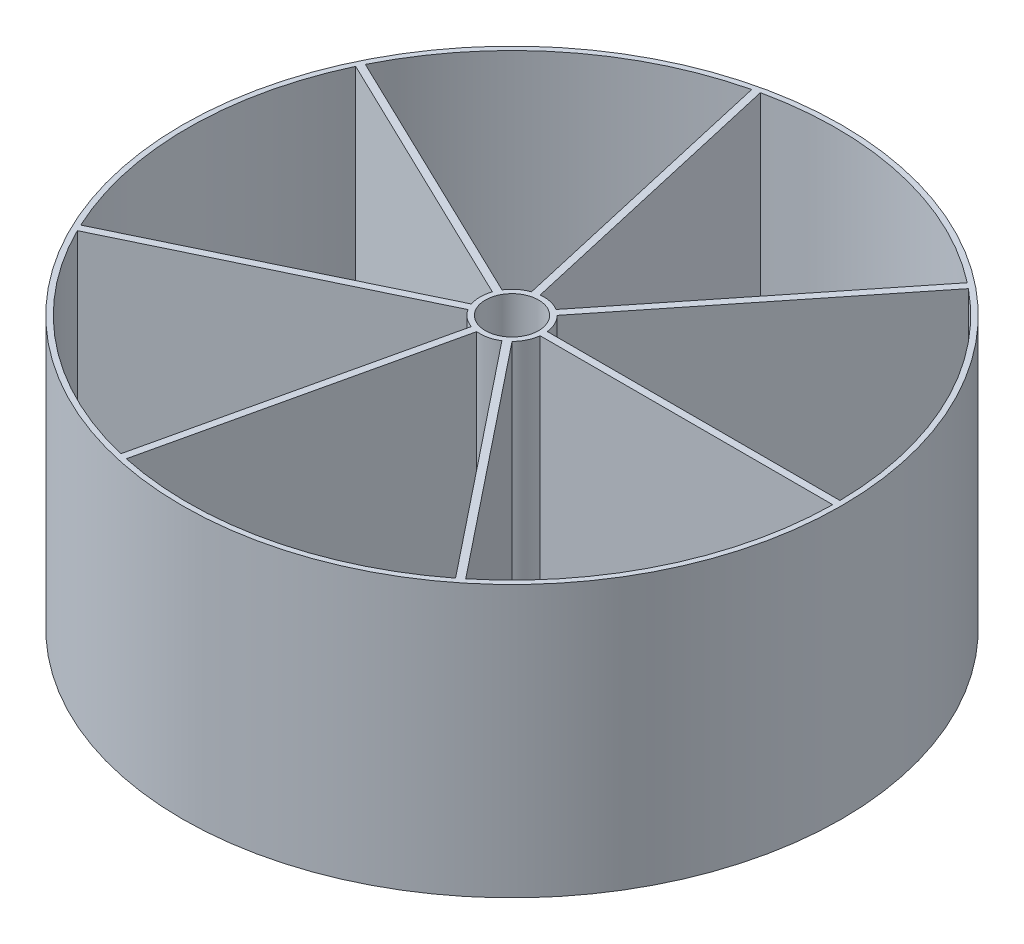
ISO-10303-21;
HEADER;
FILE_DESCRIPTION(('STEP AP214'),'2;1');
FILE_NAME('part.step','',(''),(''),'','','');
FILE_SCHEMA(('AUTOMOTIVE_DESIGN { 1 0 10303 214 1 1 1 1 }'));
ENDSEC;
DATA;
#1=APPLICATION_CONTEXT('core data for automotive mechanical design processes');
#2=APPLICATION_PROTOCOL_DEFINITION('international standard','automotive_design',2000,#1);
#3=PRODUCT_CONTEXT('',#1,'mechanical');
#4=PRODUCT('Part','Part','',(#3));
#5=PRODUCT_RELATED_PRODUCT_CATEGORY('part','',(#4));
#6=PRODUCT_DEFINITION_FORMATION('','',#4);
#7=PRODUCT_DEFINITION_CONTEXT('part definition',#1,'design');
#8=PRODUCT_DEFINITION('design','',#6,#7);
#9=PRODUCT_DEFINITION_SHAPE('','',#8);
#10=(LENGTH_UNIT() NAMED_UNIT(*) SI_UNIT(.MILLI.,.METRE.));
#11=(NAMED_UNIT(*) PLANE_ANGLE_UNIT() SI_UNIT($,.RADIAN.));
#12=(NAMED_UNIT(*) SI_UNIT($,.STERADIAN.) SOLID_ANGLE_UNIT());
#13=UNCERTAINTY_MEASURE_WITH_UNIT(LENGTH_MEASURE(1.E-05),#10,'distance_accuracy_value','');
#14=(GEOMETRIC_REPRESENTATION_CONTEXT(3) GLOBAL_UNCERTAINTY_ASSIGNED_CONTEXT((#13)) GLOBAL_UNIT_ASSIGNED_CONTEXT((#10,
#11,#12)) REPRESENTATION_CONTEXT('',''));
#15=CARTESIAN_POINT('',(0.,0.,0.));
#16=DIRECTION('',(0.,0.,1.));
#17=DIRECTION('',(1.,0.,0.));
#18=AXIS2_PLACEMENT_3D('',#15,#16,#17);
#19=CARTESIAN_POINT('',(0.,102.,0.));
#20=DIRECTION('',(0.,1.,0.));
#21=DIRECTION('',(0.,0.,1.));
#22=AXIS2_PLACEMENT_3D('',#19,#20,#21);
#23=PLANE('',#22);
#24=DIRECTION('',(0.900968867902416,0.,0.433883739117564));
#25=VECTOR('',#24,1.);
#26=CARTESIAN_POINT('',(-10.1516650680535,102.,-6.39872615026317));
#27=LINE('',#26,#25);
#28=CARTESIAN_POINT('',(-109.258240537319,102.,-54.1259374531951));
#29=VERTEX_POINT('',#28);
#30=CARTESIAN_POINT('',(-10.1516650680535,102.,-6.39872615026317));
#31=VERTEX_POINT('',#30);
#32=EDGE_CURVE('E256',#29,#31,#27,.T.);
#33=ORIENTED_EDGE('',*,*,#32,.F.);
#34=CARTESIAN_POINT('',(0.,102.,0.));
#35=DIRECTION('',(0.,1.,0.));
#36=DIRECTION('',(0.,0.,1.));
#37=AXIS2_PLACEMENT_3D('',#34,#35,#36);
#38=CIRCLE('',#37,121.93022689431);
#39=CARTESIAN_POINT('',(-28.4566414693408,102.,-118.563062489054));
#40=VERTEX_POINT('',#39);
#41=EDGE_CURVE('E254',#40,#29,#38,.T.);
#42=ORIENTED_EDGE('',*,*,#41,.F.);
#43=DIRECTION('',(-0.222520933956315,0.,-0.974927912181824));
#44=VECTOR('',#43,1.);
#45=CARTESIAN_POINT('',(-3.97933873414621,102.,-11.3209921490532));
#46=LINE('',#45,#44);
#47=CARTESIAN_POINT('',(-3.97933873414621,102.,-11.3209921490532));
#48=VERTEX_POINT('',#47);
#49=EDGE_CURVE('E262',#48,#40,#46,.T.);
#50=ORIENTED_EDGE('',*,*,#49,.F.);
#51=CARTESIAN_POINT('',(0.,102.,0.));
#52=DIRECTION('',(0.,-1.,0.));
#53=DIRECTION('',(0.,0.,1.));
#54=AXIS2_PLACEMENT_3D('',#51,#52,#53);
#55=CIRCLE('',#54,12.);
#56=EDGE_CURVE('E259',#31,#48,#55,.T.);
#57=ORIENTED_EDGE('',*,*,#56,.F.);
#58=EDGE_LOOP('',(#33,#42,#50,#57));
#59=FACE_BOUND('',#58,.T.);
#60=DIRECTION('',(0.222520933956324,0.,-0.974927912181821));
#61=VECTOR('',#60,1.);
#62=CARTESIAN_POINT('',(-3.97933873414431,102.,11.3209921490538));
#63=LINE('',#62,#61);
#64=CARTESIAN_POINT('',(-28.4566414693399,102.,118.563062489054));
#65=VERTEX_POINT('',#64);
#66=CARTESIAN_POINT('',(-3.97933873414431,102.,11.3209921490538));
#67=VERTEX_POINT('',#66);
#68=EDGE_CURVE('E318',#65,#67,#63,.T.);
#69=ORIENTED_EDGE('',*,*,#68,.F.);
#70=CARTESIAN_POINT('',(0.,102.,0.));
#71=DIRECTION('',(0.,1.,0.));
#72=DIRECTION('',(0.,0.,1.));
#73=AXIS2_PLACEMENT_3D('',#70,#71,#72);
#74=CIRCLE('',#73,121.93022689431);
#75=CARTESIAN_POINT('',(-109.258240537318,102.,54.1259374531967));
#76=VERTEX_POINT('',#75);
#77=EDGE_CURVE('E316',#76,#65,#74,.T.);
#78=ORIENTED_EDGE('',*,*,#77,.F.);
#79=DIRECTION('',(-0.900968867902419,0.,0.433883739117558));
#80=VECTOR('',#79,1.);
#81=CARTESIAN_POINT('',(-10.1516650680522,102.,6.3987261502653));
#82=LINE('',#81,#80);
#83=CARTESIAN_POINT('',(-10.1516650680522,102.,6.3987261502653));
#84=VERTEX_POINT('',#83);
#85=EDGE_CURVE('E324',#84,#76,#82,.T.);
#86=ORIENTED_EDGE('',*,*,#85,.F.);
#87=CARTESIAN_POINT('',(0.,102.,0.));
#88=DIRECTION('',(0.,-1.,0.));
#89=DIRECTION('',(0.,0.,1.));
#90=AXIS2_PLACEMENT_3D('',#87,#88,#89);
#91=CIRCLE('',#90,12.);
#92=EDGE_CURVE('E321',#67,#84,#91,.T.);
#93=ORIENTED_EDGE('',*,*,#92,.F.);
#94=EDGE_LOOP('',(#69,#78,#86,#93));
#95=FACE_BOUND('',#94,.T.);
#96=DIRECTION('',(-1.,0.,0.));
#97=VECTOR('',#96,1.);
#98=CARTESIAN_POINT('',(11.9226374113542,102.,1.36041065762396));
#99=LINE('',#98,#97);
#100=CARTESIAN_POINT('',(121.922637411354,102.,1.36041065762596));
#101=VERTEX_POINT('',#100);
#102=CARTESIAN_POINT('',(11.9226374113542,102.,1.36041065762396));
#103=VERTEX_POINT('',#102);
#104=EDGE_CURVE('E380',#101,#103,#99,.T.);
#105=ORIENTED_EDGE('',*,*,#104,.F.);
#106=CARTESIAN_POINT('',(0.,102.,0.));
#107=DIRECTION('',(0.,1.,0.));
#108=DIRECTION('',(0.,0.,1.));
#109=AXIS2_PLACEMENT_3D('',#106,#107,#108);
#110=CIRCLE('',#109,121.93022689431);
#111=CARTESIAN_POINT('',(77.081132922916,102.,94.4747541823615));
#112=VERTEX_POINT('',#111);
#113=EDGE_CURVE('E378',#112,#101,#110,.T.);
#114=ORIENTED_EDGE('',*,*,#113,.F.);
#115=DIRECTION('',(0.623489801858745,0.,0.78183148246802));
#116=VECTOR('',#115,1.);
#117=CARTESIAN_POINT('',(8.49725471845419,102.,8.47329111087941));
#118=LINE('',#117,#116);
#119=CARTESIAN_POINT('',(8.49725471845419,102.,8.47329111087941));
#120=VERTEX_POINT('',#119);
#121=EDGE_CURVE('E386',#120,#112,#118,.T.);
#122=ORIENTED_EDGE('',*,*,#121,.F.);
#123=CARTESIAN_POINT('',(0.,102.,0.));
#124=DIRECTION('',(0.,-1.,0.));
#125=DIRECTION('',(0.,0.,1.));
#126=AXIS2_PLACEMENT_3D('',#123,#124,#125);
#127=CIRCLE('',#126,12.);
#128=EDGE_CURVE('E383',#103,#120,#127,.T.);
#129=ORIENTED_EDGE('',*,*,#128,.F.);
#130=EDGE_LOOP('',(#105,#114,#122,#129));
#131=FACE_BOUND('',#130,.T.);
#132=CARTESIAN_POINT('',(0.,102.,0.));
#133=DIRECTION('',(0.,1.,0.));
#134=DIRECTION('',(0.,0.,1.));
#135=AXIS2_PLACEMENT_3D('',#132,#133,#134);
#136=CIRCLE('',#135,10.);
#137=CARTESIAN_POINT('',(0.,102.,10.));
#138=VERTEX_POINT('',#137);
#139=EDGE_CURVE('E440',#138,#138,#136,.T.);
#140=ORIENTED_EDGE('',*,*,#139,.F.);
#141=EDGE_LOOP('',(#140));
#142=FACE_BOUND('',#141,.T.);
#143=CARTESIAN_POINT('',(0.,102.,0.));
#144=DIRECTION('',(0.,1.,0.));
#145=DIRECTION('',(0.,0.,1.));
#146=AXIS2_PLACEMENT_3D('',#143,#144,#145);
#147=CIRCLE('',#146,123.93022689431);
#148=CARTESIAN_POINT('',(0.,102.,123.93022689431));
#149=VERTEX_POINT('',#148);
#150=EDGE_CURVE('E11',#149,#149,#147,.T.);
#151=ORIENTED_EDGE('',*,*,#150,.T.);
#152=EDGE_LOOP('',(#151));
#153=FACE_BOUND('',#152,.T.);
#154=DIRECTION('',(1.,0.,0.));
#155=VECTOR('',#154,1.);
#156=CARTESIAN_POINT('',(11.9226374113542,102.,-1.36041065762396));
#157=LINE('',#156,#155);
#158=CARTESIAN_POINT('',(11.9226374113542,102.,-1.36041065762396));
#159=VERTEX_POINT('',#158);
#160=CARTESIAN_POINT('',(121.922637411354,102.,-1.36041065762529));
#161=VERTEX_POINT('',#160);
#162=EDGE_CURVE('E411',#159,#161,#157,.T.);
#163=ORIENTED_EDGE('',*,*,#162,.F.);
#164=CARTESIAN_POINT('',(0.,102.,0.));
#165=DIRECTION('',(0.,-1.,0.));
#166=DIRECTION('',(0.,0.,1.));
#167=AXIS2_PLACEMENT_3D('',#164,#165,#166);
#168=CIRCLE('',#167,12.);
#169=CARTESIAN_POINT('',(8.49725471845432,102.,-8.47329111087929));
#170=VERTEX_POINT('',#169);
#171=EDGE_CURVE('E409',#170,#159,#168,.T.);
#172=ORIENTED_EDGE('',*,*,#171,.F.);
#173=DIRECTION('',(-0.623489801858745,0.,0.78183148246802));
#174=VECTOR('',#173,1.);
#175=CARTESIAN_POINT('',(8.49725471845432,102.,-8.47329111087929));
#176=LINE('',#175,#174);
#177=CARTESIAN_POINT('',(77.0811329229162,102.,-94.4747541823614));
#178=VERTEX_POINT('',#177);
#179=EDGE_CURVE('E417',#178,#170,#176,.T.);
#180=ORIENTED_EDGE('',*,*,#179,.F.);
#181=CARTESIAN_POINT('',(0.,102.,0.));
#182=DIRECTION('',(0.,1.,0.));
#183=DIRECTION('',(0.,0.,1.));
#184=AXIS2_PLACEMENT_3D('',#181,#182,#183);
#185=CIRCLE('',#184,121.93022689431);
#186=EDGE_CURVE('E414',#161,#178,#185,.T.);
#187=ORIENTED_EDGE('',*,*,#186,.F.);
#188=EDGE_LOOP('',(#163,#172,#180,#187));
#189=FACE_BOUND('',#188,.T.);
#190=DIRECTION('',(-0.623489801858722,0.,-0.781831482468039));
#191=VECTOR('',#190,1.);
#192=CARTESIAN_POINT('',(6.3700309560233,102.,10.1696954536163));
#193=LINE('',#192,#191);
#194=CARTESIAN_POINT('',(74.9539091604825,102.,96.1711585251005));
#195=VERTEX_POINT('',#194);
#196=CARTESIAN_POINT('',(6.3700309560233,102.,10.1696954536163));
#197=VERTEX_POINT('',#196);
#198=EDGE_CURVE('E349',#195,#197,#193,.T.);
#199=ORIENTED_EDGE('',*,*,#198,.F.);
#200=CARTESIAN_POINT('',(0.,102.,0.));
#201=DIRECTION('',(0.,1.,0.));
#202=DIRECTION('',(0.,0.,1.));
#203=AXIS2_PLACEMENT_3D('',#200,#201,#202);
#204=CIRCLE('',#203,121.93022689431);
#205=CARTESIAN_POINT('',(-25.8040368250422,102.,119.168502189252));
#206=VERTEX_POINT('',#205);
#207=EDGE_CURVE('E347',#206,#195,#204,.T.);
#208=ORIENTED_EDGE('',*,*,#207,.F.);
#209=DIRECTION('',(-0.222520933956314,0.,0.974927912181824));
#210=VECTOR('',#209,1.);
#211=CARTESIAN_POINT('',(-1.32673408984762,102.,11.9264318492513));
#212=LINE('',#211,#210);
#213=CARTESIAN_POINT('',(-1.32673408984762,102.,11.9264318492513));
#214=VERTEX_POINT('',#213);
#215=EDGE_CURVE('E355',#214,#206,#212,.T.);
#216=ORIENTED_EDGE('',*,*,#215,.F.);
#217=CARTESIAN_POINT('',(0.,102.,0.));
#218=DIRECTION('',(0.,-1.,0.));
#219=DIRECTION('',(0.,0.,1.));
#220=AXIS2_PLACEMENT_3D('',#217,#218,#219);
#221=CIRCLE('',#220,12.);
#222=EDGE_CURVE('E352',#197,#214,#221,.T.);
#223=ORIENTED_EDGE('',*,*,#222,.F.);
#224=EDGE_LOOP('',(#199,#208,#216,#223));
#225=FACE_BOUND('',#224,.T.);
#226=DIRECTION('',(0.900968867902422,0.,-0.433883739117553));
#227=VECTOR('',#226,1.);
#228=CARTESIAN_POINT('',(-11.3321851937841,102.,3.94735085009934));
#229=LINE('',#228,#227);
#230=CARTESIAN_POINT('',(-110.43876066305,102.,51.6745621530301));
#231=VERTEX_POINT('',#230);
#232=CARTESIAN_POINT('',(-11.3321851937841,102.,3.94735085009934));
#233=VERTEX_POINT('',#232);
#234=EDGE_CURVE('E287',#231,#233,#229,.T.);
#235=ORIENTED_EDGE('',*,*,#234,.F.);
#236=CARTESIAN_POINT('',(0.,102.,0.));
#237=DIRECTION('',(0.,1.,0.));
#238=DIRECTION('',(0.,0.,1.));
#239=AXIS2_PLACEMENT_3D('',#236,#237,#238);
#240=CIRCLE('',#239,121.93022689431);
#241=CARTESIAN_POINT('',(-110.438760663051,102.,-51.6745621530284));
#242=VERTEX_POINT('',#241);
#243=EDGE_CURVE('E285',#242,#231,#240,.T.);
#244=ORIENTED_EDGE('',*,*,#243,.F.);
#245=DIRECTION('',(-0.900968867902419,0.,-0.433883739117558));
#246=VECTOR('',#245,1.);
#247=CARTESIAN_POINT('',(-11.3321851937849,102.,-3.94735085009701));
#248=LINE('',#247,#246);
#249=CARTESIAN_POINT('',(-11.3321851937849,102.,-3.94735085009701));
#250=VERTEX_POINT('',#249);
#251=EDGE_CURVE('E293',#250,#242,#248,.T.);
#252=ORIENTED_EDGE('',*,*,#251,.F.);
#253=CARTESIAN_POINT('',(0.,102.,0.));
#254=DIRECTION('',(0.,-1.,0.));
#255=DIRECTION('',(0.,0.,1.));
#256=AXIS2_PLACEMENT_3D('',#253,#254,#255);
#257=CIRCLE('',#256,12.);
#258=EDGE_CURVE('E290',#233,#250,#257,.T.);
#259=ORIENTED_EDGE('',*,*,#258,.F.);
#260=EDGE_LOOP('',(#235,#244,#252,#259));
#261=FACE_BOUND('',#260,.T.);
#262=DIRECTION('',(0.222520933956304,0.,0.974927912181826));
#263=VECTOR('',#262,1.);
#264=CARTESIAN_POINT('',(-1.32673408984969,102.,-11.9264318492511));
#265=LINE('',#264,#263);
#266=CARTESIAN_POINT('',(-25.8040368250431,102.,-119.168502189252));
#267=VERTEX_POINT('',#266);
#268=CARTESIAN_POINT('',(-1.32673408984969,102.,-11.9264318492511));
#269=VERTEX_POINT('',#268);
#270=EDGE_CURVE('E226',#267,#269,#265,.T.);
#271=ORIENTED_EDGE('',*,*,#270,.F.);
#272=CARTESIAN_POINT('',(0.,102.,0.));
#273=DIRECTION('',(0.,1.,0.));
#274=DIRECTION('',(0.,0.,1.));
#275=AXIS2_PLACEMENT_3D('',#272,#273,#274);
#276=CIRCLE('',#275,121.93022689431);
#277=CARTESIAN_POINT('',(74.9539091604827,102.,-96.1711585251004));
#278=VERTEX_POINT('',#277);
#279=EDGE_CURVE('E218',#278,#267,#276,.T.);
#280=ORIENTED_EDGE('',*,*,#279,.F.);
#281=DIRECTION('',(0.623489801858722,0.,-0.781831482468039));
#282=VECTOR('',#281,1.);
#283=CARTESIAN_POINT('',(6.37003095602345,102.,-10.1696954536163));
#284=LINE('',#283,#282);
#285=CARTESIAN_POINT('',(6.37003095602345,102.,-10.1696954536162));
#286=VERTEX_POINT('',#285);
#287=EDGE_CURVE('E240',#286,#278,#284,.T.);
#288=ORIENTED_EDGE('',*,*,#287,.F.);
#289=CARTESIAN_POINT('',(0.,102.,0.));
#290=DIRECTION('',(0.,-1.,0.));
#291=DIRECTION('',(0.,0.,1.));
#292=AXIS2_PLACEMENT_3D('',#289,#290,#291);
#293=CIRCLE('',#292,12.);
#294=EDGE_CURVE('E238',#269,#286,#293,.T.);
#295=ORIENTED_EDGE('',*,*,#294,.F.);
#296=EDGE_LOOP('',(#271,#280,#288,#295));
#297=FACE_BOUND('',#296,.T.);
#298=ADVANCED_FACE('F33',(#59,#95,#131,#142,#153,#189,#225,#261,#297),#23,.T.);
#299=CARTESIAN_POINT('',(0.,0.,0.));
#300=DIRECTION('',(0.,1.,0.));
#301=DIRECTION('',(0.,0.,1.));
#302=AXIS2_PLACEMENT_3D('',#299,#300,#301);
#303=PLANE('',#302);
#304=CARTESIAN_POINT('',(0.,0.,0.));
#305=DIRECTION('',(0.,1.,0.));
#306=DIRECTION('',(0.,0.,1.));
#307=AXIS2_PLACEMENT_3D('',#304,#305,#306);
#308=CIRCLE('',#307,121.93022689431);
#309=CARTESIAN_POINT('',(-28.4566414693408,0.,-118.563062489054));
#310=VERTEX_POINT('',#309);
#311=CARTESIAN_POINT('',(-109.258240537319,0.,-54.1259374531951));
#312=VERTEX_POINT('',#311);
#313=EDGE_CURVE('E234',#310,#312,#308,.T.);
#314=ORIENTED_EDGE('',*,*,#313,.T.);
#315=DIRECTION('',(0.900968867902416,0.,0.433883739117564));
#316=VECTOR('',#315,1.);
#317=CARTESIAN_POINT('',(-10.1516650680535,0.,-6.39872615026317));
#318=LINE('',#317,#316);
#319=CARTESIAN_POINT('',(-10.1516650680535,0.,-6.39872615026317));
#320=VERTEX_POINT('',#319);
#321=EDGE_CURVE('E267',#312,#320,#318,.T.);
#322=ORIENTED_EDGE('',*,*,#321,.T.);
#323=CARTESIAN_POINT('',(0.,0.,0.));
#324=DIRECTION('',(0.,-1.,0.));
#325=DIRECTION('',(0.,0.,1.));
#326=AXIS2_PLACEMENT_3D('',#323,#324,#325);
#327=CIRCLE('',#326,12.);
#328=CARTESIAN_POINT('',(-3.9793387341462,0.,-11.3209921490532));
#329=VERTEX_POINT('',#328);
#330=EDGE_CURVE('E270',#320,#329,#327,.T.);
#331=ORIENTED_EDGE('',*,*,#330,.T.);
#332=DIRECTION('',(-0.222520933956315,0.,-0.974927912181824));
#333=VECTOR('',#332,1.);
#334=CARTESIAN_POINT('',(-3.97933873414621,0.,-11.3209921490532));
#335=LINE('',#334,#333);
#336=EDGE_CURVE('E257',#329,#310,#335,.T.);
#337=ORIENTED_EDGE('',*,*,#336,.T.);
#338=EDGE_LOOP('',(#314,#322,#331,#337));
#339=FACE_BOUND('',#338,.T.);
#340=CARTESIAN_POINT('',(0.,0.,0.));
#341=DIRECTION('',(0.,1.,0.));
#342=DIRECTION('',(0.,0.,1.));
#343=AXIS2_PLACEMENT_3D('',#340,#341,#342);
#344=CIRCLE('',#343,121.93022689431);
#345=CARTESIAN_POINT('',(-109.258240537318,0.,54.1259374531967));
#346=VERTEX_POINT('',#345);
#347=CARTESIAN_POINT('',(-28.4566414693399,0.,118.563062489054));
#348=VERTEX_POINT('',#347);
#349=EDGE_CURVE('E315',#346,#348,#344,.T.);
#350=ORIENTED_EDGE('',*,*,#349,.T.);
#351=DIRECTION('',(0.222520933956324,0.,-0.974927912181821));
#352=VECTOR('',#351,1.);
#353=CARTESIAN_POINT('',(-3.97933873414431,0.,11.3209921490538));
#354=LINE('',#353,#352);
#355=CARTESIAN_POINT('',(-3.97933873414431,0.,11.3209921490538));
#356=VERTEX_POINT('',#355);
#357=EDGE_CURVE('E329',#348,#356,#354,.T.);
#358=ORIENTED_EDGE('',*,*,#357,.T.);
#359=CARTESIAN_POINT('',(0.,0.,0.));
#360=DIRECTION('',(0.,-1.,0.));
#361=DIRECTION('',(0.,0.,1.));
#362=AXIS2_PLACEMENT_3D('',#359,#360,#361);
#363=CIRCLE('',#362,12.);
#364=CARTESIAN_POINT('',(-10.1516650680522,0.,6.39872615026529));
#365=VERTEX_POINT('',#364);
#366=EDGE_CURVE('E332',#356,#365,#363,.T.);
#367=ORIENTED_EDGE('',*,*,#366,.T.);
#368=DIRECTION('',(-0.900968867902419,0.,0.433883739117558));
#369=VECTOR('',#368,1.);
#370=CARTESIAN_POINT('',(-10.1516650680522,0.,6.3987261502653));
#371=LINE('',#370,#369);
#372=EDGE_CURVE('E319',#365,#346,#371,.T.);
#373=ORIENTED_EDGE('',*,*,#372,.T.);
#374=EDGE_LOOP('',(#350,#358,#367,#373));
#375=FACE_BOUND('',#374,.T.);
#376=CARTESIAN_POINT('',(0.,0.,0.));
#377=DIRECTION('',(0.,1.,0.));
#378=DIRECTION('',(0.,0.,1.));
#379=AXIS2_PLACEMENT_3D('',#376,#377,#378);
#380=CIRCLE('',#379,121.93022689431);
#381=CARTESIAN_POINT('',(77.081132922916,0.,94.4747541823614));
#382=VERTEX_POINT('',#381);
#383=CARTESIAN_POINT('',(121.922637411354,0.,1.36041065762596));
#384=VERTEX_POINT('',#383);
#385=EDGE_CURVE('E377',#382,#384,#380,.T.);
#386=ORIENTED_EDGE('',*,*,#385,.T.);
#387=DIRECTION('',(-1.,0.,0.));
#388=VECTOR('',#387,1.);
#389=CARTESIAN_POINT('',(11.9226374113542,0.,1.36041065762396));
#390=LINE('',#389,#388);
#391=CARTESIAN_POINT('',(11.9226374113542,0.,1.36041065762396));
#392=VERTEX_POINT('',#391);
#393=EDGE_CURVE('E391',#384,#392,#390,.T.);
#394=ORIENTED_EDGE('',*,*,#393,.T.);
#395=CARTESIAN_POINT('',(0.,0.,0.));
#396=DIRECTION('',(0.,-1.,0.));
#397=DIRECTION('',(0.,0.,1.));
#398=AXIS2_PLACEMENT_3D('',#395,#396,#397);
#399=CIRCLE('',#398,12.);
#400=CARTESIAN_POINT('',(8.49725471845419,0.,8.47329111087941));
#401=VERTEX_POINT('',#400);
#402=EDGE_CURVE('E394',#392,#401,#399,.T.);
#403=ORIENTED_EDGE('',*,*,#402,.T.);
#404=DIRECTION('',(0.623489801858745,0.,0.78183148246802));
#405=VECTOR('',#404,1.);
#406=CARTESIAN_POINT('',(8.49725471845419,0.,8.47329111087941));
#407=LINE('',#406,#405);
#408=EDGE_CURVE('E381',#401,#382,#407,.T.);
#409=ORIENTED_EDGE('',*,*,#408,.T.);
#410=EDGE_LOOP('',(#386,#394,#403,#409));
#411=FACE_BOUND('',#410,.T.);
#412=CARTESIAN_POINT('',(0.,0.,0.));
#413=DIRECTION('',(0.,1.,0.));
#414=DIRECTION('',(0.,0.,1.));
#415=AXIS2_PLACEMENT_3D('',#412,#413,#414);
#416=CIRCLE('',#415,10.);
#417=CARTESIAN_POINT('',(0.,0.,10.));
#418=VERTEX_POINT('',#417);
#419=EDGE_CURVE('E439',#418,#418,#416,.T.);
#420=ORIENTED_EDGE('',*,*,#419,.T.);
#421=EDGE_LOOP('',(#420));
#422=FACE_BOUND('',#421,.T.);
#423=CARTESIAN_POINT('',(0.,0.,0.));
#424=DIRECTION('',(0.,1.,0.));
#425=DIRECTION('',(0.,0.,1.));
#426=AXIS2_PLACEMENT_3D('',#423,#424,#425);
#427=CIRCLE('',#426,123.93022689431);
#428=CARTESIAN_POINT('',(0.,0.,123.93022689431));
#429=VERTEX_POINT('',#428);
#430=EDGE_CURVE('E37',#429,#429,#427,.T.);
#431=ORIENTED_EDGE('',*,*,#430,.F.);
#432=EDGE_LOOP('',(#431));
#433=FACE_BOUND('',#432,.T.);
#434=CARTESIAN_POINT('',(0.,0.,0.));
#435=DIRECTION('',(0.,-1.,0.));
#436=DIRECTION('',(0.,0.,1.));
#437=AXIS2_PLACEMENT_3D('',#434,#435,#436);
#438=CIRCLE('',#437,12.);
#439=CARTESIAN_POINT('',(8.49725471845432,0.,-8.47329111087929));
#440=VERTEX_POINT('',#439);
#441=CARTESIAN_POINT('',(11.9226374113542,0.,-1.36041065762396));
#442=VERTEX_POINT('',#441);
#443=EDGE_CURVE('E408',#440,#442,#438,.T.);
#444=ORIENTED_EDGE('',*,*,#443,.T.);
#445=DIRECTION('',(1.,0.,0.));
#446=VECTOR('',#445,1.);
#447=CARTESIAN_POINT('',(11.9226374113542,0.,-1.36041065762396));
#448=LINE('',#447,#446);
#449=CARTESIAN_POINT('',(121.922637411354,0.,-1.36041065762529));
#450=VERTEX_POINT('',#449);
#451=EDGE_CURVE('E422',#442,#450,#448,.T.);
#452=ORIENTED_EDGE('',*,*,#451,.T.);
#453=CARTESIAN_POINT('',(0.,0.,0.));
#454=DIRECTION('',(0.,1.,0.));
#455=DIRECTION('',(0.,0.,1.));
#456=AXIS2_PLACEMENT_3D('',#453,#454,#455);
#457=CIRCLE('',#456,121.93022689431);
#458=CARTESIAN_POINT('',(77.0811329229162,0.,-94.4747541823614));
#459=VERTEX_POINT('',#458);
#460=EDGE_CURVE('E425',#450,#459,#457,.T.);
#461=ORIENTED_EDGE('',*,*,#460,.T.);
#462=DIRECTION('',(-0.623489801858745,0.,0.78183148246802));
#463=VECTOR('',#462,1.);
#464=CARTESIAN_POINT('',(8.49725471845432,0.,-8.47329111087929));
#465=LINE('',#464,#463);
#466=EDGE_CURVE('E412',#459,#440,#465,.T.);
#467=ORIENTED_EDGE('',*,*,#466,.T.);
#468=EDGE_LOOP('',(#444,#452,#461,#467));
#469=FACE_BOUND('',#468,.T.);
#470=CARTESIAN_POINT('',(0.,0.,0.));
#471=DIRECTION('',(0.,1.,0.));
#472=DIRECTION('',(0.,0.,1.));
#473=AXIS2_PLACEMENT_3D('',#470,#471,#472);
#474=CIRCLE('',#473,121.93022689431);
#475=CARTESIAN_POINT('',(-25.8040368250422,0.,119.168502189252));
#476=VERTEX_POINT('',#475);
#477=CARTESIAN_POINT('',(74.9539091604825,0.,96.1711585251005));
#478=VERTEX_POINT('',#477);
#479=EDGE_CURVE('E346',#476,#478,#474,.T.);
#480=ORIENTED_EDGE('',*,*,#479,.T.);
#481=DIRECTION('',(-0.623489801858722,0.,-0.781831482468039));
#482=VECTOR('',#481,1.);
#483=CARTESIAN_POINT('',(6.3700309560233,0.,10.1696954536163));
#484=LINE('',#483,#482);
#485=CARTESIAN_POINT('',(6.3700309560233,0.,10.1696954536163));
#486=VERTEX_POINT('',#485);
#487=EDGE_CURVE('E360',#478,#486,#484,.T.);
#488=ORIENTED_EDGE('',*,*,#487,.T.);
#489=CARTESIAN_POINT('',(0.,0.,0.));
#490=DIRECTION('',(0.,-1.,0.));
#491=DIRECTION('',(0.,0.,1.));
#492=AXIS2_PLACEMENT_3D('',#489,#490,#491);
#493=CIRCLE('',#492,12.);
#494=CARTESIAN_POINT('',(-1.32673408984762,0.,11.9264318492513));
#495=VERTEX_POINT('',#494);
#496=EDGE_CURVE('E363',#486,#495,#493,.T.);
#497=ORIENTED_EDGE('',*,*,#496,.T.);
#498=DIRECTION('',(-0.222520933956314,0.,0.974927912181824));
#499=VECTOR('',#498,1.);
#500=CARTESIAN_POINT('',(-1.32673408984762,0.,11.9264318492513));
#501=LINE('',#500,#499);
#502=EDGE_CURVE('E350',#495,#476,#501,.T.);
#503=ORIENTED_EDGE('',*,*,#502,.T.);
#504=EDGE_LOOP('',(#480,#488,#497,#503));
#505=FACE_BOUND('',#504,.T.);
#506=CARTESIAN_POINT('',(0.,0.,0.));
#507=DIRECTION('',(0.,1.,0.));
#508=DIRECTION('',(0.,0.,1.));
#509=AXIS2_PLACEMENT_3D('',#506,#507,#508);
#510=CIRCLE('',#509,121.93022689431);
#511=CARTESIAN_POINT('',(-110.438760663051,0.,-51.6745621530284));
#512=VERTEX_POINT('',#511);
#513=CARTESIAN_POINT('',(-110.43876066305,0.,51.6745621530301));
#514=VERTEX_POINT('',#513);
#515=EDGE_CURVE('E284',#512,#514,#510,.T.);
#516=ORIENTED_EDGE('',*,*,#515,.T.);
#517=DIRECTION('',(0.900968867902422,0.,-0.433883739117553));
#518=VECTOR('',#517,1.);
#519=CARTESIAN_POINT('',(-11.3321851937841,0.,3.94735085009934));
#520=LINE('',#519,#518);
#521=CARTESIAN_POINT('',(-11.3321851937841,0.,3.94735085009934));
#522=VERTEX_POINT('',#521);
#523=EDGE_CURVE('E298',#514,#522,#520,.T.);
#524=ORIENTED_EDGE('',*,*,#523,.T.);
#525=CARTESIAN_POINT('',(0.,0.,0.));
#526=DIRECTION('',(0.,-1.,0.));
#527=DIRECTION('',(0.,0.,1.));
#528=AXIS2_PLACEMENT_3D('',#525,#526,#527);
#529=CIRCLE('',#528,12.);
#530=CARTESIAN_POINT('',(-11.3321851937849,0.,-3.94735085009702));
#531=VERTEX_POINT('',#530);
#532=EDGE_CURVE('E301',#522,#531,#529,.T.);
#533=ORIENTED_EDGE('',*,*,#532,.T.);
#534=DIRECTION('',(-0.900968867902419,0.,-0.433883739117558));
#535=VECTOR('',#534,1.);
#536=CARTESIAN_POINT('',(-11.3321851937849,0.,-3.94735085009701));
#537=LINE('',#536,#535);
#538=EDGE_CURVE('E288',#531,#512,#537,.T.);
#539=ORIENTED_EDGE('',*,*,#538,.T.);
#540=EDGE_LOOP('',(#516,#524,#533,#539));
#541=FACE_BOUND('',#540,.T.);
#542=CARTESIAN_POINT('',(0.,0.,0.));
#543=DIRECTION('',(0.,1.,0.));
#544=DIRECTION('',(0.,0.,1.));
#545=AXIS2_PLACEMENT_3D('',#542,#543,#544);
#546=CIRCLE('',#545,121.93022689431);
#547=CARTESIAN_POINT('',(74.9539091604827,0.,-96.1711585251004));
#548=VERTEX_POINT('',#547);
#549=CARTESIAN_POINT('',(-25.8040368250431,0.,-119.168502189252));
#550=VERTEX_POINT('',#549);
#551=EDGE_CURVE('E56',#548,#550,#546,.T.);
#552=ORIENTED_EDGE('',*,*,#551,.T.);
#553=DIRECTION('',(0.222520933956304,0.,0.974927912181826));
#554=VECTOR('',#553,1.);
#555=CARTESIAN_POINT('',(-1.32673408984969,0.,-11.9264318492511));
#556=LINE('',#555,#554);
#557=CARTESIAN_POINT('',(-1.32673408984969,0.,-11.9264318492511));
#558=VERTEX_POINT('',#557);
#559=EDGE_CURVE('E233',#550,#558,#556,.T.);
#560=ORIENTED_EDGE('',*,*,#559,.T.);
#561=CARTESIAN_POINT('',(0.,0.,0.));
#562=DIRECTION('',(0.,-1.,0.));
#563=DIRECTION('',(0.,0.,1.));
#564=AXIS2_PLACEMENT_3D('',#561,#562,#563);
#565=CIRCLE('',#564,12.);
#566=CARTESIAN_POINT('',(6.37003095602345,0.,-10.1696954536162));
#567=VERTEX_POINT('',#566);
#568=EDGE_CURVE('E246',#558,#567,#565,.T.);
#569=ORIENTED_EDGE('',*,*,#568,.T.);
#570=DIRECTION('',(0.623489801858722,0.,-0.781831482468039));
#571=VECTOR('',#570,1.);
#572=CARTESIAN_POINT('',(6.37003095602345,0.,-10.1696954536163));
#573=LINE('',#572,#571);
#574=EDGE_CURVE('E227',#567,#548,#573,.T.);
#575=ORIENTED_EDGE('',*,*,#574,.T.);
#576=EDGE_LOOP('',(#552,#560,#569,#575));
#577=FACE_BOUND('',#576,.T.);
#578=ADVANCED_FACE('F446',(#339,#375,#411,#422,#433,#469,#505,#541,#577),#303,.F.);
#579=CARTESIAN_POINT('',(0.,102.,0.));
#580=DIRECTION('',(0.,-1.,0.));
#581=DIRECTION('',(0.,0.,-1.));
#582=AXIS2_PLACEMENT_3D('',#579,#580,#581);
#583=CYLINDRICAL_SURFACE('',#582,123.93022689431);
#584=ORIENTED_EDGE('',*,*,#150,.F.);
#585=EDGE_LOOP('',(#584));
#586=FACE_BOUND('',#585,.T.);
#587=ORIENTED_EDGE('',*,*,#430,.T.);
#588=EDGE_LOOP('',(#587));
#589=FACE_BOUND('',#588,.T.);
#590=ADVANCED_FACE('F35',(#586,#589),#583,.T.);
#591=CARTESIAN_POINT('',(0.,102.,0.));
#592=DIRECTION('',(0.,-1.,0.));
#593=DIRECTION('',(0.,0.,-1.));
#594=AXIS2_PLACEMENT_3D('',#591,#592,#593);
#595=CYLINDRICAL_SURFACE('',#594,10.);
#596=ORIENTED_EDGE('',*,*,#139,.T.);
#597=EDGE_LOOP('',(#596));
#598=FACE_BOUND('',#597,.T.);
#599=ORIENTED_EDGE('',*,*,#419,.F.);
#600=EDGE_LOOP('',(#599));
#601=FACE_BOUND('',#600,.T.);
#602=ADVANCED_FACE('F449',(#598,#601),#595,.F.);
#603=CARTESIAN_POINT('',(0.,102.,0.));
#604=DIRECTION('',(0.,-1.,0.));
#605=DIRECTION('',(0.,0.,-1.));
#606=AXIS2_PLACEMENT_3D('',#603,#604,#605);
#607=CYLINDRICAL_SURFACE('',#606,12.);
#608=ORIENTED_EDGE('',*,*,#443,.F.);
#609=DIRECTION('',(0.,-1.,0.));
#610=VECTOR('',#609,1.);
#611=CARTESIAN_POINT('',(8.49725471845432,102.,-8.47329111087929));
#612=LINE('',#611,#610);
#613=EDGE_CURVE('E419',#170,#440,#612,.T.);
#614=ORIENTED_EDGE('',*,*,#613,.F.);
#615=ORIENTED_EDGE('',*,*,#171,.T.);
#616=DIRECTION('',(0.,-1.,0.));
#617=VECTOR('',#616,1.);
#618=CARTESIAN_POINT('',(11.9226374113542,102.,-1.36041065762396));
#619=LINE('',#618,#617);
#620=EDGE_CURVE('E436',#159,#442,#619,.T.);
#621=ORIENTED_EDGE('',*,*,#620,.T.);
#622=EDGE_LOOP('',(#608,#614,#615,#621));
#623=FACE_BOUND('',#622,.T.);
#624=ADVANCED_FACE('F451',(#623),#607,.T.);
#625=CARTESIAN_POINT('',(11.9226374113542,102.,-1.36041065762396));
#626=DIRECTION('',(0.,0.,-1.));
#627=DIRECTION('',(-1.,0.,0.));
#628=AXIS2_PLACEMENT_3D('',#625,#626,#627);
#629=PLANE('',#628);
#630=ORIENTED_EDGE('',*,*,#451,.F.);
#631=ORIENTED_EDGE('',*,*,#620,.F.);
#632=ORIENTED_EDGE('',*,*,#162,.T.);
#633=DIRECTION('',(0.,-1.,0.));
#634=VECTOR('',#633,1.);
#635=CARTESIAN_POINT('',(121.922637411354,102.,-1.36041065762529));
#636=LINE('',#635,#634);
#637=EDGE_CURVE('E434',#161,#450,#636,.T.);
#638=ORIENTED_EDGE('',*,*,#637,.T.);
#639=EDGE_LOOP('',(#630,#631,#632,#638));
#640=FACE_BOUND('',#639,.T.);
#641=ADVANCED_FACE('F458',(#640),#629,.T.);
#642=CARTESIAN_POINT('',(0.,102.,0.));
#643=DIRECTION('',(0.,-1.,0.));
#644=DIRECTION('',(0.,0.,-1.));
#645=AXIS2_PLACEMENT_3D('',#642,#643,#644);
#646=CYLINDRICAL_SURFACE('',#645,121.93022689431);
#647=ORIENTED_EDGE('',*,*,#460,.F.);
#648=ORIENTED_EDGE('',*,*,#637,.F.);
#649=ORIENTED_EDGE('',*,*,#186,.T.);
#650=DIRECTION('',(0.,-1.,0.));
#651=VECTOR('',#650,1.);
#652=CARTESIAN_POINT('',(77.0811329229162,102.,-94.4747541823614));
#653=LINE('',#652,#651);
#654=EDGE_CURVE('E432',#178,#459,#653,.T.);
#655=ORIENTED_EDGE('',*,*,#654,.T.);
#656=EDGE_LOOP('',(#647,#648,#649,#655));
#657=FACE_BOUND('',#656,.T.);
#658=ADVANCED_FACE('F580',(#657),#646,.F.);
#659=CARTESIAN_POINT('',(8.49725471845432,102.,-8.47329111087929));
#660=DIRECTION('',(0.78183148246802,0.,0.623489801858745));
#661=DIRECTION('',(0.623489801858745,0.,-0.78183148246802));
#662=AXIS2_PLACEMENT_3D('',#659,#660,#661);
#663=PLANE('',#662);
#664=ORIENTED_EDGE('',*,*,#466,.F.);
#665=ORIENTED_EDGE('',*,*,#654,.F.);
#666=ORIENTED_EDGE('',*,*,#179,.T.);
#667=ORIENTED_EDGE('',*,*,#613,.T.);
#668=EDGE_LOOP('',(#664,#665,#666,#667));
#669=FACE_BOUND('',#668,.T.);
#670=ADVANCED_FACE('F576',(#669),#663,.T.);
#671=CARTESIAN_POINT('',(0.,102.,0.));
#672=DIRECTION('',(0.,-1.,0.));
#673=DIRECTION('',(0.,0.,-1.));
#674=AXIS2_PLACEMENT_3D('',#671,#672,#673);
#675=CYLINDRICAL_SURFACE('',#674,121.93022689431);
#676=ORIENTED_EDGE('',*,*,#385,.F.);
#677=DIRECTION('',(0.,-1.,0.));
#678=VECTOR('',#677,1.);
#679=CARTESIAN_POINT('',(77.081132922916,102.,94.4747541823615));
#680=LINE('',#679,#678);
#681=EDGE_CURVE('E388',#112,#382,#680,.T.);
#682=ORIENTED_EDGE('',*,*,#681,.F.);
#683=ORIENTED_EDGE('',*,*,#113,.T.);
#684=DIRECTION('',(0.,-1.,0.));
#685=VECTOR('',#684,1.);
#686=CARTESIAN_POINT('',(121.922637411354,102.,1.36041065762596));
#687=LINE('',#686,#685);
#688=EDGE_CURVE('E405',#101,#384,#687,.T.);
#689=ORIENTED_EDGE('',*,*,#688,.T.);
#690=EDGE_LOOP('',(#676,#682,#683,#689));
#691=FACE_BOUND('',#690,.T.);
#692=ADVANCED_FACE('F572',(#691),#675,.F.);
#693=CARTESIAN_POINT('',(11.9226374113542,102.,1.36041065762396));
#694=DIRECTION('',(0.,0.,1.));
#695=DIRECTION('',(1.,0.,0.));
#696=AXIS2_PLACEMENT_3D('',#693,#694,#695);
#697=PLANE('',#696);
#698=ORIENTED_EDGE('',*,*,#393,.F.);
#699=ORIENTED_EDGE('',*,*,#688,.F.);
#700=ORIENTED_EDGE('',*,*,#104,.T.);
#701=DIRECTION('',(0.,-1.,0.));
#702=VECTOR('',#701,1.);
#703=CARTESIAN_POINT('',(11.9226374113542,102.,1.36041065762396));
#704=LINE('',#703,#702);
#705=EDGE_CURVE('E403',#103,#392,#704,.T.);
#706=ORIENTED_EDGE('',*,*,#705,.T.);
#707=EDGE_LOOP('',(#698,#699,#700,#706));
#708=FACE_BOUND('',#707,.T.);
#709=ADVANCED_FACE('F568',(#708),#697,.T.);
#710=CARTESIAN_POINT('',(0.,102.,0.));
#711=DIRECTION('',(0.,-1.,0.));
#712=DIRECTION('',(0.,0.,-1.));
#713=AXIS2_PLACEMENT_3D('',#710,#711,#712);
#714=CYLINDRICAL_SURFACE('',#713,12.);
#715=ORIENTED_EDGE('',*,*,#402,.F.);
#716=ORIENTED_EDGE('',*,*,#705,.F.);
#717=ORIENTED_EDGE('',*,*,#128,.T.);
#718=DIRECTION('',(0.,-1.,0.));
#719=VECTOR('',#718,1.);
#720=CARTESIAN_POINT('',(8.49725471845419,102.,8.47329111087941));
#721=LINE('',#720,#719);
#722=EDGE_CURVE('E401',#120,#401,#721,.T.);
#723=ORIENTED_EDGE('',*,*,#722,.T.);
#724=EDGE_LOOP('',(#715,#716,#717,#723));
#725=FACE_BOUND('',#724,.T.);
#726=ADVANCED_FACE('F564',(#725),#714,.T.);
#727=CARTESIAN_POINT('',(8.49725471845419,102.,8.47329111087941));
#728=DIRECTION('',(0.78183148246802,0.,-0.623489801858745));
#729=DIRECTION('',(-0.623489801858745,0.,-0.78183148246802));
#730=AXIS2_PLACEMENT_3D('',#727,#728,#729);
#731=PLANE('',#730);
#732=ORIENTED_EDGE('',*,*,#408,.F.);
#733=ORIENTED_EDGE('',*,*,#722,.F.);
#734=ORIENTED_EDGE('',*,*,#121,.T.);
#735=ORIENTED_EDGE('',*,*,#681,.T.);
#736=EDGE_LOOP('',(#732,#733,#734,#735));
#737=FACE_BOUND('',#736,.T.);
#738=ADVANCED_FACE('F560',(#737),#731,.T.);
#739=CARTESIAN_POINT('',(0.,102.,0.));
#740=DIRECTION('',(0.,-1.,0.));
#741=DIRECTION('',(0.,0.,-1.));
#742=AXIS2_PLACEMENT_3D('',#739,#740,#741);
#743=CYLINDRICAL_SURFACE('',#742,121.93022689431);
#744=ORIENTED_EDGE('',*,*,#479,.F.);
#745=DIRECTION('',(0.,-1.,0.));
#746=VECTOR('',#745,1.);
#747=CARTESIAN_POINT('',(-25.8040368250422,102.,119.168502189252));
#748=LINE('',#747,#746);
#749=EDGE_CURVE('E357',#206,#476,#748,.T.);
#750=ORIENTED_EDGE('',*,*,#749,.F.);
#751=ORIENTED_EDGE('',*,*,#207,.T.);
#752=DIRECTION('',(0.,-1.,0.));
#753=VECTOR('',#752,1.);
#754=CARTESIAN_POINT('',(74.9539091604825,102.,96.1711585251005));
#755=LINE('',#754,#753);
#756=EDGE_CURVE('E374',#195,#478,#755,.T.);
#757=ORIENTED_EDGE('',*,*,#756,.T.);
#758=EDGE_LOOP('',(#744,#750,#751,#757));
#759=FACE_BOUND('',#758,.T.);
#760=ADVANCED_FACE('F556',(#759),#743,.F.);
#761=CARTESIAN_POINT('',(6.3700309560233,102.,10.1696954536163));
#762=DIRECTION('',(-0.781831482468039,0.,0.623489801858722));
#763=DIRECTION('',(0.623489801858722,0.,0.781831482468039));
#764=AXIS2_PLACEMENT_3D('',#761,#762,#763);
#765=PLANE('',#764);
#766=ORIENTED_EDGE('',*,*,#487,.F.);
#767=ORIENTED_EDGE('',*,*,#756,.F.);
#768=ORIENTED_EDGE('',*,*,#198,.T.);
#769=DIRECTION('',(0.,-1.,0.));
#770=VECTOR('',#769,1.);
#771=CARTESIAN_POINT('',(6.3700309560233,102.,10.1696954536163));
#772=LINE('',#771,#770);
#773=EDGE_CURVE('E372',#197,#486,#772,.T.);
#774=ORIENTED_EDGE('',*,*,#773,.T.);
#775=EDGE_LOOP('',(#766,#767,#768,#774));
#776=FACE_BOUND('',#775,.T.);
#777=ADVANCED_FACE('F552',(#776),#765,.T.);
#778=CARTESIAN_POINT('',(0.,102.,0.));
#779=DIRECTION('',(0.,-1.,0.));
#780=DIRECTION('',(0.,0.,-1.));
#781=AXIS2_PLACEMENT_3D('',#778,#779,#780);
#782=CYLINDRICAL_SURFACE('',#781,12.);
#783=ORIENTED_EDGE('',*,*,#496,.F.);
#784=ORIENTED_EDGE('',*,*,#773,.F.);
#785=ORIENTED_EDGE('',*,*,#222,.T.);
#786=DIRECTION('',(0.,-1.,0.));
#787=VECTOR('',#786,1.);
#788=CARTESIAN_POINT('',(-1.32673408984762,102.,11.9264318492513));
#789=LINE('',#788,#787);
#790=EDGE_CURVE('E370',#214,#495,#789,.T.);
#791=ORIENTED_EDGE('',*,*,#790,.T.);
#792=EDGE_LOOP('',(#783,#784,#785,#791));
#793=FACE_BOUND('',#792,.T.);
#794=ADVANCED_FACE('F548',(#793),#782,.T.);
#795=CARTESIAN_POINT('',(-1.32673408984762,102.,11.9264318492513));
#796=DIRECTION('',(0.974927912181824,0.,0.222520933956314));
#797=DIRECTION('',(0.222520933956314,0.,-0.974927912181824));
#798=AXIS2_PLACEMENT_3D('',#795,#796,#797);
#799=PLANE('',#798);
#800=ORIENTED_EDGE('',*,*,#502,.F.);
#801=ORIENTED_EDGE('',*,*,#790,.F.);
#802=ORIENTED_EDGE('',*,*,#215,.T.);
#803=ORIENTED_EDGE('',*,*,#749,.T.);
#804=EDGE_LOOP('',(#800,#801,#802,#803));
#805=FACE_BOUND('',#804,.T.);
#806=ADVANCED_FACE('F544',(#805),#799,.T.);
#807=CARTESIAN_POINT('',(0.,102.,0.));
#808=DIRECTION('',(0.,-1.,0.));
#809=DIRECTION('',(0.,0.,-1.));
#810=AXIS2_PLACEMENT_3D('',#807,#808,#809);
#811=CYLINDRICAL_SURFACE('',#810,121.93022689431);
#812=ORIENTED_EDGE('',*,*,#349,.F.);
#813=DIRECTION('',(0.,-1.,0.));
#814=VECTOR('',#813,1.);
#815=CARTESIAN_POINT('',(-109.258240537318,102.,54.1259374531967));
#816=LINE('',#815,#814);
#817=EDGE_CURVE('E326',#76,#346,#816,.T.);
#818=ORIENTED_EDGE('',*,*,#817,.F.);
#819=ORIENTED_EDGE('',*,*,#77,.T.);
#820=DIRECTION('',(0.,-1.,0.));
#821=VECTOR('',#820,1.);
#822=CARTESIAN_POINT('',(-28.4566414693399,102.,118.563062489054));
#823=LINE('',#822,#821);
#824=EDGE_CURVE('E343',#65,#348,#823,.T.);
#825=ORIENTED_EDGE('',*,*,#824,.T.);
#826=EDGE_LOOP('',(#812,#818,#819,#825));
#827=FACE_BOUND('',#826,.T.);
#828=ADVANCED_FACE('F540',(#827),#811,.F.);
#829=CARTESIAN_POINT('',(-3.97933873414431,102.,11.3209921490538));
#830=DIRECTION('',(-0.974927912181822,0.,-0.222520933956324));
#831=DIRECTION('',(-0.222520933956324,0.,0.974927912181822));
#832=AXIS2_PLACEMENT_3D('',#829,#830,#831);
#833=PLANE('',#832);
#834=ORIENTED_EDGE('',*,*,#357,.F.);
#835=ORIENTED_EDGE('',*,*,#824,.F.);
#836=ORIENTED_EDGE('',*,*,#68,.T.);
#837=DIRECTION('',(0.,-1.,0.));
#838=VECTOR('',#837,1.);
#839=CARTESIAN_POINT('',(-3.97933873414431,102.,11.3209921490538));
#840=LINE('',#839,#838);
#841=EDGE_CURVE('E341',#67,#356,#840,.T.);
#842=ORIENTED_EDGE('',*,*,#841,.T.);
#843=EDGE_LOOP('',(#834,#835,#836,#842));
#844=FACE_BOUND('',#843,.T.);
#845=ADVANCED_FACE('F536',(#844),#833,.T.);
#846=CARTESIAN_POINT('',(0.,102.,0.));
#847=DIRECTION('',(0.,-1.,0.));
#848=DIRECTION('',(0.,0.,-1.));
#849=AXIS2_PLACEMENT_3D('',#846,#847,#848);
#850=CYLINDRICAL_SURFACE('',#849,12.);
#851=ORIENTED_EDGE('',*,*,#366,.F.);
#852=ORIENTED_EDGE('',*,*,#841,.F.);
#853=ORIENTED_EDGE('',*,*,#92,.T.);
#854=DIRECTION('',(0.,-1.,0.));
#855=VECTOR('',#854,1.);
#856=CARTESIAN_POINT('',(-10.1516650680522,102.,6.39872615026529));
#857=LINE('',#856,#855);
#858=EDGE_CURVE('E339',#84,#365,#857,.T.);
#859=ORIENTED_EDGE('',*,*,#858,.T.);
#860=EDGE_LOOP('',(#851,#852,#853,#859));
#861=FACE_BOUND('',#860,.T.);
#862=ADVANCED_FACE('F532',(#861),#850,.T.);
#863=CARTESIAN_POINT('',(-10.1516650680522,102.,6.3987261502653));
#864=DIRECTION('',(0.433883739117558,0.,0.900968867902419));
#865=DIRECTION('',(0.900968867902419,0.,-0.433883739117558));
#866=AXIS2_PLACEMENT_3D('',#863,#864,#865);
#867=PLANE('',#866);
#868=ORIENTED_EDGE('',*,*,#372,.F.);
#869=ORIENTED_EDGE('',*,*,#858,.F.);
#870=ORIENTED_EDGE('',*,*,#85,.T.);
#871=ORIENTED_EDGE('',*,*,#817,.T.);
#872=EDGE_LOOP('',(#868,#869,#870,#871));
#873=FACE_BOUND('',#872,.T.);
#874=ADVANCED_FACE('F529',(#873),#867,.T.);
#875=CARTESIAN_POINT('',(0.,102.,0.));
#876=DIRECTION('',(0.,-1.,0.));
#877=DIRECTION('',(0.,0.,-1.));
#878=AXIS2_PLACEMENT_3D('',#875,#876,#877);
#879=CYLINDRICAL_SURFACE('',#878,121.93022689431);
#880=ORIENTED_EDGE('',*,*,#515,.F.);
#881=DIRECTION('',(0.,-1.,0.));
#882=VECTOR('',#881,1.);
#883=CARTESIAN_POINT('',(-110.438760663051,102.,-51.6745621530284));
#884=LINE('',#883,#882);
#885=EDGE_CURVE('E295',#242,#512,#884,.T.);
#886=ORIENTED_EDGE('',*,*,#885,.F.);
#887=ORIENTED_EDGE('',*,*,#243,.T.);
#888=DIRECTION('',(0.,-1.,0.));
#889=VECTOR('',#888,1.);
#890=CARTESIAN_POINT('',(-110.43876066305,102.,51.6745621530301));
#891=LINE('',#890,#889);
#892=EDGE_CURVE('E312',#231,#514,#891,.T.);
#893=ORIENTED_EDGE('',*,*,#892,.T.);
#894=EDGE_LOOP('',(#880,#886,#887,#893));
#895=FACE_BOUND('',#894,.T.);
#896=ADVANCED_FACE('F508',(#895),#879,.F.);
#897=CARTESIAN_POINT('',(-11.3321851937841,102.,3.94735085009934));
#898=DIRECTION('',(-0.433883739117553,0.,-0.900968867902422));
#899=DIRECTION('',(-0.900968867902422,0.,0.433883739117553));
#900=AXIS2_PLACEMENT_3D('',#897,#898,#899);
#901=PLANE('',#900);
#902=ORIENTED_EDGE('',*,*,#523,.F.);
#903=ORIENTED_EDGE('',*,*,#892,.F.);
#904=ORIENTED_EDGE('',*,*,#234,.T.);
#905=DIRECTION('',(0.,-1.,0.));
#906=VECTOR('',#905,1.);
#907=CARTESIAN_POINT('',(-11.3321851937841,102.,3.94735085009934));
#908=LINE('',#907,#906);
#909=EDGE_CURVE('E310',#233,#522,#908,.T.);
#910=ORIENTED_EDGE('',*,*,#909,.T.);
#911=EDGE_LOOP('',(#902,#903,#904,#910));
#912=FACE_BOUND('',#911,.T.);
#913=ADVANCED_FACE('F500',(#912),#901,.T.);
#914=CARTESIAN_POINT('',(0.,102.,0.));
#915=DIRECTION('',(0.,-1.,0.));
#916=DIRECTION('',(0.,0.,-1.));
#917=AXIS2_PLACEMENT_3D('',#914,#915,#916);
#918=CYLINDRICAL_SURFACE('',#917,12.);
#919=ORIENTED_EDGE('',*,*,#532,.F.);
#920=ORIENTED_EDGE('',*,*,#909,.F.);
#921=ORIENTED_EDGE('',*,*,#258,.T.);
#922=DIRECTION('',(0.,-1.,0.));
#923=VECTOR('',#922,1.);
#924=CARTESIAN_POINT('',(-11.3321851937849,102.,-3.94735085009702));
#925=LINE('',#924,#923);
#926=EDGE_CURVE('E308',#250,#531,#925,.T.);
#927=ORIENTED_EDGE('',*,*,#926,.T.);
#928=EDGE_LOOP('',(#919,#920,#921,#927));
#929=FACE_BOUND('',#928,.T.);
#930=ADVANCED_FACE('F503',(#929),#918,.T.);
#931=CARTESIAN_POINT('',(-11.3321851937849,102.,-3.94735085009701));
#932=DIRECTION('',(-0.433883739117558,0.,0.900968867902419));
#933=DIRECTION('',(0.900968867902419,0.,0.433883739117558));
#934=AXIS2_PLACEMENT_3D('',#931,#932,#933);
#935=PLANE('',#934);
#936=ORIENTED_EDGE('',*,*,#538,.F.);
#937=ORIENTED_EDGE('',*,*,#926,.F.);
#938=ORIENTED_EDGE('',*,*,#251,.T.);
#939=ORIENTED_EDGE('',*,*,#885,.T.);
#940=EDGE_LOOP('',(#936,#937,#938,#939));
#941=FACE_BOUND('',#940,.T.);
#942=ADVANCED_FACE('F511',(#941),#935,.T.);
#943=CARTESIAN_POINT('',(0.,102.,0.));
#944=DIRECTION('',(0.,-1.,0.));
#945=DIRECTION('',(0.,0.,-1.));
#946=AXIS2_PLACEMENT_3D('',#943,#944,#945);
#947=CYLINDRICAL_SURFACE('',#946,121.93022689431);
#948=ORIENTED_EDGE('',*,*,#313,.F.);
#949=DIRECTION('',(0.,-1.,0.));
#950=VECTOR('',#949,1.);
#951=CARTESIAN_POINT('',(-28.4566414693408,102.,-118.563062489054));
#952=LINE('',#951,#950);
#953=EDGE_CURVE('E264',#40,#310,#952,.T.);
#954=ORIENTED_EDGE('',*,*,#953,.F.);
#955=ORIENTED_EDGE('',*,*,#41,.T.);
#956=DIRECTION('',(0.,-1.,0.));
#957=VECTOR('',#956,1.);
#958=CARTESIAN_POINT('',(-109.258240537319,102.,-54.1259374531951));
#959=LINE('',#958,#957);
#960=EDGE_CURVE('E281',#29,#312,#959,.T.);
#961=ORIENTED_EDGE('',*,*,#960,.T.);
#962=EDGE_LOOP('',(#948,#954,#955,#961));
#963=FACE_BOUND('',#962,.T.);
#964=ADVANCED_FACE('F513',(#963),#947,.F.);
#965=CARTESIAN_POINT('',(-10.1516650680535,102.,-6.39872615026317));
#966=DIRECTION('',(0.433883739117564,0.,-0.900968867902416));
#967=DIRECTION('',(-0.900968867902416,0.,-0.433883739117564));
#968=AXIS2_PLACEMENT_3D('',#965,#966,#967);
#969=PLANE('',#968);
#970=ORIENTED_EDGE('',*,*,#321,.F.);
#971=ORIENTED_EDGE('',*,*,#960,.F.);
#972=ORIENTED_EDGE('',*,*,#32,.T.);
#973=DIRECTION('',(0.,-1.,0.));
#974=VECTOR('',#973,1.);
#975=CARTESIAN_POINT('',(-10.1516650680535,102.,-6.39872615026317));
#976=LINE('',#975,#974);
#977=EDGE_CURVE('E279',#31,#320,#976,.T.);
#978=ORIENTED_EDGE('',*,*,#977,.T.);
#979=EDGE_LOOP('',(#970,#971,#972,#978));
#980=FACE_BOUND('',#979,.T.);
#981=ADVANCED_FACE('F519',(#980),#969,.T.);
#982=CARTESIAN_POINT('',(0.,102.,0.));
#983=DIRECTION('',(0.,-1.,0.));
#984=DIRECTION('',(0.,0.,-1.));
#985=AXIS2_PLACEMENT_3D('',#982,#983,#984);
#986=CYLINDRICAL_SURFACE('',#985,12.);
#987=ORIENTED_EDGE('',*,*,#330,.F.);
#988=ORIENTED_EDGE('',*,*,#977,.F.);
#989=ORIENTED_EDGE('',*,*,#56,.T.);
#990=DIRECTION('',(0.,-1.,0.));
#991=VECTOR('',#990,1.);
#992=CARTESIAN_POINT('',(-3.9793387341462,102.,-11.3209921490532));
#993=LINE('',#992,#991);
#994=EDGE_CURVE('E277',#48,#329,#993,.T.);
#995=ORIENTED_EDGE('',*,*,#994,.T.);
#996=EDGE_LOOP('',(#987,#988,#989,#995));
#997=FACE_BOUND('',#996,.T.);
#998=ADVANCED_FACE('F692',(#997),#986,.T.);
#999=CARTESIAN_POINT('',(-3.97933873414621,102.,-11.3209921490532));
#1000=DIRECTION('',(-0.974927912181824,0.,0.222520933956315));
#1001=DIRECTION('',(0.222520933956315,0.,0.974927912181824));
#1002=AXIS2_PLACEMENT_3D('',#999,#1000,#1001);
#1003=PLANE('',#1002);
#1004=ORIENTED_EDGE('',*,*,#336,.F.);
#1005=ORIENTED_EDGE('',*,*,#994,.F.);
#1006=ORIENTED_EDGE('',*,*,#49,.T.);
#1007=ORIENTED_EDGE('',*,*,#953,.T.);
#1008=EDGE_LOOP('',(#1004,#1005,#1006,#1007));
#1009=FACE_BOUND('',#1008,.T.);
#1010=ADVANCED_FACE('F701',(#1009),#1003,.T.);
#1011=CARTESIAN_POINT('',(0.,102.,0.));
#1012=DIRECTION('',(0.,-1.,0.));
#1013=DIRECTION('',(0.,0.,-1.));
#1014=AXIS2_PLACEMENT_3D('',#1011,#1012,#1013);
#1015=CYLINDRICAL_SURFACE('',#1014,121.93022689431);
#1016=ORIENTED_EDGE('',*,*,#551,.F.);
#1017=DIRECTION('',(0.,-1.,0.));
#1018=VECTOR('',#1017,1.);
#1019=CARTESIAN_POINT('',(74.9539091604827,102.,-96.1711585251004));
#1020=LINE('',#1019,#1018);
#1021=EDGE_CURVE('E222',#278,#548,#1020,.T.);
#1022=ORIENTED_EDGE('',*,*,#1021,.F.);
#1023=ORIENTED_EDGE('',*,*,#279,.T.);
#1024=DIRECTION('',(0.,-1.,0.));
#1025=VECTOR('',#1024,1.);
#1026=CARTESIAN_POINT('',(-25.8040368250431,102.,-119.168502189252));
#1027=LINE('',#1026,#1025);
#1028=EDGE_CURVE('E221',#267,#550,#1027,.T.);
#1029=ORIENTED_EDGE('',*,*,#1028,.T.);
#1030=EDGE_LOOP('',(#1016,#1022,#1023,#1029));
#1031=FACE_BOUND('',#1030,.T.);
#1032=ADVANCED_FACE('F220',(#1031),#1015,.F.);
#1033=CARTESIAN_POINT('',(-1.32673408984969,102.,-11.9264318492511));
#1034=DIRECTION('',(0.974927912181826,0.,-0.222520933956304));
#1035=DIRECTION('',(-0.222520933956304,0.,-0.974927912181826));
#1036=AXIS2_PLACEMENT_3D('',#1033,#1034,#1035);
#1037=PLANE('',#1036);
#1038=ORIENTED_EDGE('',*,*,#559,.F.);
#1039=ORIENTED_EDGE('',*,*,#1028,.F.);
#1040=ORIENTED_EDGE('',*,*,#270,.T.);
#1041=DIRECTION('',(0.,-1.,0.));
#1042=VECTOR('',#1041,1.);
#1043=CARTESIAN_POINT('',(-1.32673408984969,102.,-11.9264318492511));
#1044=LINE('',#1043,#1042);
#1045=EDGE_CURVE('E235',#269,#558,#1044,.T.);
#1046=ORIENTED_EDGE('',*,*,#1045,.T.);
#1047=EDGE_LOOP('',(#1038,#1039,#1040,#1046));
#1048=FACE_BOUND('',#1047,.T.);
#1049=ADVANCED_FACE('F230',(#1048),#1037,.T.);
#1050=CARTESIAN_POINT('',(0.,102.,0.));
#1051=DIRECTION('',(0.,-1.,0.));
#1052=DIRECTION('',(0.,0.,-1.));
#1053=AXIS2_PLACEMENT_3D('',#1050,#1051,#1052);
#1054=CYLINDRICAL_SURFACE('',#1053,12.);
#1055=ORIENTED_EDGE('',*,*,#568,.F.);
#1056=ORIENTED_EDGE('',*,*,#1045,.F.);
#1057=ORIENTED_EDGE('',*,*,#294,.T.);
#1058=DIRECTION('',(0.,-1.,0.));
#1059=VECTOR('',#1058,1.);
#1060=CARTESIAN_POINT('',(6.37003095602345,102.,-10.1696954536162));
#1061=LINE('',#1060,#1059);
#1062=EDGE_CURVE('E48',#286,#567,#1061,.T.);
#1063=ORIENTED_EDGE('',*,*,#1062,.T.);
#1064=EDGE_LOOP('',(#1055,#1056,#1057,#1063));
#1065=FACE_BOUND('',#1064,.T.);
#1066=ADVANCED_FACE('F728',(#1065),#1054,.T.);
#1067=CARTESIAN_POINT('',(6.37003095602345,102.,-10.1696954536163));
#1068=DIRECTION('',(-0.781831482468039,0.,-0.623489801858722));
#1069=DIRECTION('',(-0.623489801858722,0.,0.781831482468039));
#1070=AXIS2_PLACEMENT_3D('',#1067,#1068,#1069);
#1071=PLANE('',#1070);
#1072=ORIENTED_EDGE('',*,*,#574,.F.);
#1073=ORIENTED_EDGE('',*,*,#1062,.F.);
#1074=ORIENTED_EDGE('',*,*,#287,.T.);
#1075=ORIENTED_EDGE('',*,*,#1021,.T.);
#1076=EDGE_LOOP('',(#1072,#1073,#1074,#1075));
#1077=FACE_BOUND('',#1076,.T.);
#1078=ADVANCED_FACE('F737',(#1077),#1071,.T.);
#1079=CLOSED_SHELL('',(#298,#578,#590,#602,#624,#641,#658,#670,#692,#709,#726,#738,#760,#777,
#794,#806,#828,#845,#862,#874,#896,#913,#930,#942,#964,#981,#998,#1010,#1032,#1049,#1066,#1078));
#1080=MANIFOLD_SOLID_BREP('B2',#1079);
#1081=ADVANCED_BREP_SHAPE_REPRESENTATION('',(#18,#1080),#14);
#1082=SHAPE_DEFINITION_REPRESENTATION(#9,#1081);
ENDSEC;
END-ISO-10303-21;
